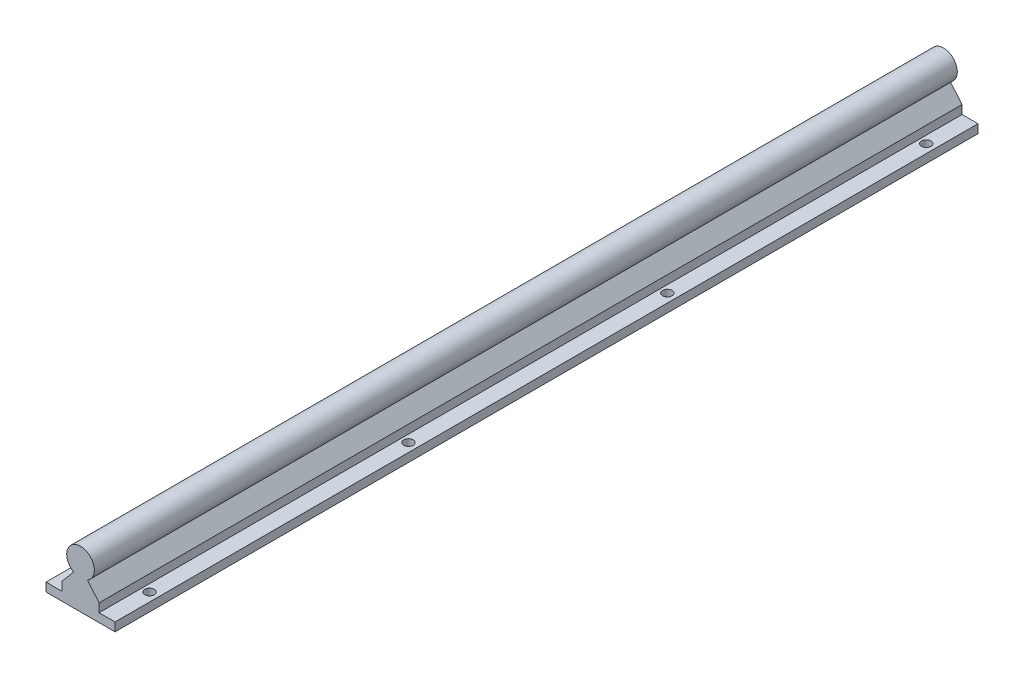
ISO-10303-21;
HEADER;
FILE_DESCRIPTION(('STEP AP214'),'2;1');
FILE_NAME('part.step','',(''),(''),'','','');
FILE_SCHEMA(('AUTOMOTIVE_DESIGN { 1 0 10303 214 1 1 1 1 }'));
ENDSEC;
DATA;
#1=APPLICATION_CONTEXT('core data for automotive mechanical design processes');
#2=APPLICATION_PROTOCOL_DEFINITION('international standard','automotive_design',2000,#1);
#3=PRODUCT_CONTEXT('',#1,'mechanical');
#4=PRODUCT('Part','Part','',(#3));
#5=PRODUCT_RELATED_PRODUCT_CATEGORY('part','',(#4));
#6=PRODUCT_DEFINITION_FORMATION('','',#4);
#7=PRODUCT_DEFINITION_CONTEXT('part definition',#1,'design');
#8=PRODUCT_DEFINITION('design','',#6,#7);
#9=PRODUCT_DEFINITION_SHAPE('','',#8);
#10=(LENGTH_UNIT() NAMED_UNIT(*) SI_UNIT(.MILLI.,.METRE.));
#11=(NAMED_UNIT(*) PLANE_ANGLE_UNIT() SI_UNIT($,.RADIAN.));
#12=(NAMED_UNIT(*) SI_UNIT($,.STERADIAN.) SOLID_ANGLE_UNIT());
#13=UNCERTAINTY_MEASURE_WITH_UNIT(LENGTH_MEASURE(1.E-05),#10,'distance_accuracy_value','');
#14=(GEOMETRIC_REPRESENTATION_CONTEXT(3) GLOBAL_UNCERTAINTY_ASSIGNED_CONTEXT((#13)) GLOBAL_UNIT_ASSIGNED_CONTEXT((#10,
#11,#12)) REPRESENTATION_CONTEXT('',''));
#15=CARTESIAN_POINT('',(0.,0.,0.));
#16=DIRECTION('',(0.,0.,1.));
#17=DIRECTION('',(1.,0.,0.));
#18=AXIS2_PLACEMENT_3D('',#15,#16,#17);
#19=CARTESIAN_POINT('',(-21.6204068953766,0.,500.));
#20=DIRECTION('',(1.,0.,0.));
#21=DIRECTION('',(0.,0.,-1.));
#22=AXIS2_PLACEMENT_3D('',#19,#20,#21);
#23=PLANE('',#22);
#24=DIRECTION('',(0.,-1.,0.));
#25=VECTOR('',#24,1.);
#26=CARTESIAN_POINT('',(-21.6204068953766,0.,0.));
#27=LINE('',#26,#25);
#28=CARTESIAN_POINT('',(-21.6204068953766,5.,0.));
#29=VERTEX_POINT('',#28);
#30=CARTESIAN_POINT('',(-21.6204068953766,0.,0.));
#31=VERTEX_POINT('',#30);
#32=EDGE_CURVE('E143',#29,#31,#27,.T.);
#33=ORIENTED_EDGE('',*,*,#32,.T.);
#34=DIRECTION('',(0.,0.,-1.));
#35=VECTOR('',#34,1.);
#36=CARTESIAN_POINT('',(-21.6204068953766,0.,500.));
#37=LINE('',#36,#35);
#38=CARTESIAN_POINT('',(-21.6204068953766,0.,500.));
#39=VERTEX_POINT('',#38);
#40=EDGE_CURVE('E11',#39,#31,#37,.T.);
#41=ORIENTED_EDGE('',*,*,#40,.F.);
#42=DIRECTION('',(0.,-1.,0.));
#43=VECTOR('',#42,1.);
#44=CARTESIAN_POINT('',(-21.6204068953766,0.,500.));
#45=LINE('',#44,#43);
#46=CARTESIAN_POINT('',(-21.6204068953766,5.,500.));
#47=VERTEX_POINT('',#46);
#48=EDGE_CURVE('E161',#47,#39,#45,.T.);
#49=ORIENTED_EDGE('',*,*,#48,.F.);
#50=DIRECTION('',(0.,0.,-1.));
#51=VECTOR('',#50,1.);
#52=CARTESIAN_POINT('',(-21.6204068953766,5.,500.));
#53=LINE('',#52,#51);
#54=EDGE_CURVE('E139',#47,#29,#53,.T.);
#55=ORIENTED_EDGE('',*,*,#54,.T.);
#56=EDGE_LOOP('',(#33,#41,#49,#55));
#57=FACE_BOUND('',#56,.T.);
#58=ADVANCED_FACE('F33',(#57),#23,.F.);
#59=CARTESIAN_POINT('',(-21.6204068953766,0.,500.));
#60=DIRECTION('',(0.,1.,0.));
#61=DIRECTION('',(0.,0.,1.));
#62=AXIS2_PLACEMENT_3D('',#59,#60,#61);
#63=PLANE('',#62);
#64=CARTESIAN_POINT('',(-16.6204068953766,0.,175.));
#65=DIRECTION('',(0.,1.,0.));
#66=DIRECTION('',(0.,0.,1.));
#67=AXIS2_PLACEMENT_3D('',#64,#65,#66);
#68=CIRCLE('',#67,2.75);
#69=CARTESIAN_POINT('',(-16.6204068953766,0.,177.75));
#70=VERTEX_POINT('',#69);
#71=EDGE_CURVE('E257',#70,#70,#68,.T.);
#72=ORIENTED_EDGE('',*,*,#71,.T.);
#73=EDGE_LOOP('',(#72));
#74=FACE_BOUND('',#73,.T.);
#75=CARTESIAN_POINT('',(13.3795931046234,0.,325.));
#76=DIRECTION('',(0.,1.,0.));
#77=DIRECTION('',(0.,0.,1.));
#78=AXIS2_PLACEMENT_3D('',#75,#76,#77);
#79=CIRCLE('',#78,2.75);
#80=CARTESIAN_POINT('',(13.3795931046234,0.,327.75));
#81=VERTEX_POINT('',#80);
#82=EDGE_CURVE('E254',#81,#81,#79,.T.);
#83=ORIENTED_EDGE('',*,*,#82,.T.);
#84=EDGE_LOOP('',(#83));
#85=FACE_BOUND('',#84,.T.);
#86=CARTESIAN_POINT('',(-16.6204068953766,0.,325.));
#87=DIRECTION('',(0.,1.,0.));
#88=DIRECTION('',(0.,0.,1.));
#89=AXIS2_PLACEMENT_3D('',#86,#87,#88);
#90=CIRCLE('',#89,2.75);
#91=CARTESIAN_POINT('',(-16.6204068953766,0.,327.75));
#92=VERTEX_POINT('',#91);
#93=EDGE_CURVE('E251',#92,#92,#90,.T.);
#94=ORIENTED_EDGE('',*,*,#93,.T.);
#95=EDGE_LOOP('',(#94));
#96=FACE_BOUND('',#95,.T.);
#97=CARTESIAN_POINT('',(13.3795931046234,0.,475.));
#98=DIRECTION('',(0.,1.,0.));
#99=DIRECTION('',(0.,0.,1.));
#100=AXIS2_PLACEMENT_3D('',#97,#98,#99);
#101=CIRCLE('',#100,2.75);
#102=CARTESIAN_POINT('',(13.3795931046234,0.,477.75));
#103=VERTEX_POINT('',#102);
#104=EDGE_CURVE('E250',#103,#103,#101,.T.);
#105=ORIENTED_EDGE('',*,*,#104,.T.);
#106=EDGE_LOOP('',(#105));
#107=FACE_BOUND('',#106,.T.);
#108=CARTESIAN_POINT('',(13.3795931046234,0.,25.));
#109=DIRECTION('',(0.,1.,0.));
#110=DIRECTION('',(0.,0.,1.));
#111=AXIS2_PLACEMENT_3D('',#108,#109,#110);
#112=CIRCLE('',#111,2.75);
#113=CARTESIAN_POINT('',(13.3795931046234,0.,27.75));
#114=VERTEX_POINT('',#113);
#115=EDGE_CURVE('E266',#114,#114,#112,.T.);
#116=ORIENTED_EDGE('',*,*,#115,.T.);
#117=EDGE_LOOP('',(#116));
#118=FACE_BOUND('',#117,.T.);
#119=CARTESIAN_POINT('',(-16.6204068953766,0.,25.));
#120=DIRECTION('',(0.,1.,0.));
#121=DIRECTION('',(0.,0.,1.));
#122=AXIS2_PLACEMENT_3D('',#119,#120,#121);
#123=CIRCLE('',#122,2.75);
#124=CARTESIAN_POINT('',(-16.6204068953766,0.,27.75));
#125=VERTEX_POINT('',#124);
#126=EDGE_CURVE('E263',#125,#125,#123,.T.);
#127=ORIENTED_EDGE('',*,*,#126,.T.);
#128=EDGE_LOOP('',(#127));
#129=FACE_BOUND('',#128,.T.);
#130=CARTESIAN_POINT('',(13.3795931046234,0.,175.));
#131=DIRECTION('',(0.,1.,0.));
#132=DIRECTION('',(0.,0.,1.));
#133=AXIS2_PLACEMENT_3D('',#130,#131,#132);
#134=CIRCLE('',#133,2.75);
#135=CARTESIAN_POINT('',(13.3795931046234,0.,177.75));
#136=VERTEX_POINT('',#135);
#137=EDGE_CURVE('E260',#136,#136,#134,.T.);
#138=ORIENTED_EDGE('',*,*,#137,.T.);
#139=EDGE_LOOP('',(#138));
#140=FACE_BOUND('',#139,.T.);
#141=CARTESIAN_POINT('',(-16.6204068953766,0.,475.));
#142=DIRECTION('',(0.,1.,0.));
#143=DIRECTION('',(0.,0.,1.));
#144=AXIS2_PLACEMENT_3D('',#141,#142,#143);
#145=CIRCLE('',#144,2.75);
#146=CARTESIAN_POINT('',(-16.6204068953766,0.,477.75));
#147=VERTEX_POINT('',#146);
#148=EDGE_CURVE('E183',#147,#147,#145,.T.);
#149=ORIENTED_EDGE('',*,*,#148,.T.);
#150=EDGE_LOOP('',(#149));
#151=FACE_BOUND('',#150,.T.);
#152=DIRECTION('',(1.,0.,0.));
#153=VECTOR('',#152,1.);
#154=CARTESIAN_POINT('',(-21.6204068953766,0.,0.));
#155=LINE('',#154,#153);
#156=CARTESIAN_POINT('',(18.3795931046234,0.,0.));
#157=VERTEX_POINT('',#156);
#158=EDGE_CURVE('E146',#31,#157,#155,.T.);
#159=ORIENTED_EDGE('',*,*,#158,.T.);
#160=DIRECTION('',(0.,0.,-1.));
#161=VECTOR('',#160,1.);
#162=CARTESIAN_POINT('',(18.3795931046234,0.,500.));
#163=LINE('',#162,#161);
#164=CARTESIAN_POINT('',(18.3795931046234,0.,500.));
#165=VERTEX_POINT('',#164);
#166=EDGE_CURVE('E42',#165,#157,#163,.T.);
#167=ORIENTED_EDGE('',*,*,#166,.F.);
#168=DIRECTION('',(1.,0.,0.));
#169=VECTOR('',#168,1.);
#170=CARTESIAN_POINT('',(-21.6204068953766,0.,500.));
#171=LINE('',#170,#169);
#172=EDGE_CURVE('E100',#39,#165,#171,.T.);
#173=ORIENTED_EDGE('',*,*,#172,.F.);
#174=ORIENTED_EDGE('',*,*,#40,.T.);
#175=EDGE_LOOP('',(#159,#167,#173,#174));
#176=FACE_BOUND('',#175,.T.);
#177=ADVANCED_FACE('F272',(#74,#85,#96,#107,#118,#129,#140,#151,#176),#63,.F.);
#178=CARTESIAN_POINT('',(18.3795931046234,0.,500.));
#179=DIRECTION('',(-1.,0.,0.));
#180=DIRECTION('',(0.,0.,1.));
#181=AXIS2_PLACEMENT_3D('',#178,#179,#180);
#182=PLANE('',#181);
#183=DIRECTION('',(0.,1.,0.));
#184=VECTOR('',#183,1.);
#185=CARTESIAN_POINT('',(18.3795931046234,0.,0.));
#186=LINE('',#185,#184);
#187=CARTESIAN_POINT('',(18.3795931046234,5.,0.));
#188=VERTEX_POINT('',#187);
#189=EDGE_CURVE('E148',#157,#188,#186,.T.);
#190=ORIENTED_EDGE('',*,*,#189,.T.);
#191=DIRECTION('',(0.,0.,-1.));
#192=VECTOR('',#191,1.);
#193=CARTESIAN_POINT('',(18.3795931046234,5.,500.));
#194=LINE('',#193,#192);
#195=CARTESIAN_POINT('',(18.3795931046234,5.,500.));
#196=VERTEX_POINT('',#195);
#197=EDGE_CURVE('E174',#196,#188,#194,.T.);
#198=ORIENTED_EDGE('',*,*,#197,.F.);
#199=DIRECTION('',(0.,1.,0.));
#200=VECTOR('',#199,1.);
#201=CARTESIAN_POINT('',(18.3795931046234,0.,500.));
#202=LINE('',#201,#200);
#203=EDGE_CURVE('E244',#165,#196,#202,.T.);
#204=ORIENTED_EDGE('',*,*,#203,.F.);
#205=ORIENTED_EDGE('',*,*,#166,.T.);
#206=EDGE_LOOP('',(#190,#198,#204,#205));
#207=FACE_BOUND('',#206,.T.);
#208=ADVANCED_FACE('F210',(#207),#182,.F.);
#209=CARTESIAN_POINT('',(18.3795931046234,5.,500.));
#210=DIRECTION('',(0.,-1.,0.));
#211=DIRECTION('',(0.,0.,-1.));
#212=AXIS2_PLACEMENT_3D('',#209,#210,#211);
#213=PLANE('',#212);
#214=CARTESIAN_POINT('',(13.3795931046234,5.,325.));
#215=DIRECTION('',(0.,-1.,0.));
#216=DIRECTION('',(0.,0.,-1.));
#217=AXIS2_PLACEMENT_3D('',#214,#215,#216);
#218=CIRCLE('',#217,2.75);
#219=CARTESIAN_POINT('',(13.3795931046234,5.,322.25));
#220=VERTEX_POINT('',#219);
#221=EDGE_CURVE('E36',#220,#220,#218,.F.);
#222=ORIENTED_EDGE('',*,*,#221,.F.);
#223=EDGE_LOOP('',(#222));
#224=FACE_BOUND('',#223,.T.);
#225=CARTESIAN_POINT('',(13.3795931046234,5.,475.));
#226=DIRECTION('',(0.,-1.,0.));
#227=DIRECTION('',(0.,0.,-1.));
#228=AXIS2_PLACEMENT_3D('',#225,#226,#227);
#229=CIRCLE('',#228,2.75);
#230=CARTESIAN_POINT('',(13.3795931046234,5.,472.25));
#231=VERTEX_POINT('',#230);
#232=EDGE_CURVE('E197',#231,#231,#229,.F.);
#233=ORIENTED_EDGE('',*,*,#232,.F.);
#234=EDGE_LOOP('',(#233));
#235=FACE_BOUND('',#234,.T.);
#236=CARTESIAN_POINT('',(13.3795931046234,5.,25.));
#237=DIRECTION('',(0.,-1.,0.));
#238=DIRECTION('',(0.,0.,-1.));
#239=AXIS2_PLACEMENT_3D('',#236,#237,#238);
#240=CIRCLE('',#239,2.75);
#241=CARTESIAN_POINT('',(13.3795931046234,5.,22.25));
#242=VERTEX_POINT('',#241);
#243=EDGE_CURVE('E195',#242,#242,#240,.F.);
#244=ORIENTED_EDGE('',*,*,#243,.F.);
#245=EDGE_LOOP('',(#244));
#246=FACE_BOUND('',#245,.T.);
#247=CARTESIAN_POINT('',(13.3795931046234,5.,175.));
#248=DIRECTION('',(0.,-1.,0.));
#249=DIRECTION('',(0.,0.,-1.));
#250=AXIS2_PLACEMENT_3D('',#247,#248,#249);
#251=CIRCLE('',#250,2.75);
#252=CARTESIAN_POINT('',(13.3795931046234,5.,172.25));
#253=VERTEX_POINT('',#252);
#254=EDGE_CURVE('E192',#253,#253,#251,.F.);
#255=ORIENTED_EDGE('',*,*,#254,.F.);
#256=EDGE_LOOP('',(#255));
#257=FACE_BOUND('',#256,.T.);
#258=DIRECTION('',(-1.,0.,0.));
#259=VECTOR('',#258,1.);
#260=CARTESIAN_POINT('',(18.3795931046234,5.,0.));
#261=LINE('',#260,#259);
#262=CARTESIAN_POINT('',(9.15263479703719,5.,0.));
#263=VERTEX_POINT('',#262);
#264=EDGE_CURVE('E150',#188,#263,#261,.T.);
#265=ORIENTED_EDGE('',*,*,#264,.T.);
#266=DIRECTION('',(0.,0.,-1.));
#267=VECTOR('',#266,1.);
#268=CARTESIAN_POINT('',(9.15263479703719,5.,500.));
#269=LINE('',#268,#267);
#270=CARTESIAN_POINT('',(9.15263479703719,5.,500.));
#271=VERTEX_POINT('',#270);
#272=EDGE_CURVE('E171',#271,#263,#269,.T.);
#273=ORIENTED_EDGE('',*,*,#272,.F.);
#274=DIRECTION('',(-1.,0.,0.));
#275=VECTOR('',#274,1.);
#276=CARTESIAN_POINT('',(18.3795931046234,5.,500.));
#277=LINE('',#276,#275);
#278=EDGE_CURVE('E242',#196,#271,#277,.T.);
#279=ORIENTED_EDGE('',*,*,#278,.F.);
#280=ORIENTED_EDGE('',*,*,#197,.T.);
#281=EDGE_LOOP('',(#265,#273,#279,#280));
#282=FACE_BOUND('',#281,.T.);
#283=ADVANCED_FACE('F206',(#224,#235,#246,#257,#282),#213,.F.);
#284=CARTESIAN_POINT('',(9.15263479703719,5.,500.));
#285=DIRECTION('',(-1.,0.,0.));
#286=DIRECTION('',(0.,0.,1.));
#287=AXIS2_PLACEMENT_3D('',#284,#285,#286);
#288=PLANE('',#287);
#289=DIRECTION('',(0.,1.,0.));
#290=VECTOR('',#289,1.);
#291=CARTESIAN_POINT('',(9.15263479703719,5.,0.));
#292=LINE('',#291,#290);
#293=CARTESIAN_POINT('',(9.15263479703719,10.,0.));
#294=VERTEX_POINT('',#293);
#295=EDGE_CURVE('E152',#263,#294,#292,.T.);
#296=ORIENTED_EDGE('',*,*,#295,.T.);
#297=DIRECTION('',(0.,0.,-1.));
#298=VECTOR('',#297,1.);
#299=CARTESIAN_POINT('',(9.15263479703719,10.,500.));
#300=LINE('',#299,#298);
#301=CARTESIAN_POINT('',(9.15263479703719,10.,500.));
#302=VERTEX_POINT('',#301);
#303=EDGE_CURVE('E168',#302,#294,#300,.T.);
#304=ORIENTED_EDGE('',*,*,#303,.F.);
#305=DIRECTION('',(0.,1.,0.));
#306=VECTOR('',#305,1.);
#307=CARTESIAN_POINT('',(9.15263479703719,5.,500.));
#308=LINE('',#307,#306);
#309=EDGE_CURVE('E227',#271,#302,#308,.T.);
#310=ORIENTED_EDGE('',*,*,#309,.F.);
#311=ORIENTED_EDGE('',*,*,#272,.T.);
#312=EDGE_LOOP('',(#296,#304,#310,#311));
#313=FACE_BOUND('',#312,.T.);
#314=ADVANCED_FACE('F209',(#313),#288,.F.);
#315=CARTESIAN_POINT('',(9.15263479703719,10.,500.));
#316=DIRECTION('',(-0.766044443118977,-0.64278760968654,0.));
#317=DIRECTION('',(0.64278760968654,-0.766044443118977,0.));
#318=AXIS2_PLACEMENT_3D('',#315,#316,#317);
#319=PLANE('',#318);
#320=DIRECTION('',(-0.64278760968654,0.766044443118977,0.));
#321=VECTOR('',#320,1.);
#322=CARTESIAN_POINT('',(9.15263479703719,10.,0.));
#323=LINE('',#322,#321);
#324=CARTESIAN_POINT('',(2.37959310462339,18.0717967697245,0.));
#325=VERTEX_POINT('',#324);
#326=EDGE_CURVE('E154',#294,#325,#323,.T.);
#327=ORIENTED_EDGE('',*,*,#326,.T.);
#328=DIRECTION('',(0.,0.,-1.));
#329=VECTOR('',#328,1.);
#330=CARTESIAN_POINT('',(2.37959310462339,18.0717967697245,500.));
#331=LINE('',#330,#329);
#332=CARTESIAN_POINT('',(2.37959310462339,18.0717967697245,500.));
#333=VERTEX_POINT('',#332);
#334=EDGE_CURVE('E165',#333,#325,#331,.T.);
#335=ORIENTED_EDGE('',*,*,#334,.F.);
#336=DIRECTION('',(-0.64278760968654,0.766044443118977,0.));
#337=VECTOR('',#336,1.);
#338=CARTESIAN_POINT('',(9.15263479703719,10.,500.));
#339=LINE('',#338,#337);
#340=EDGE_CURVE('E238',#302,#333,#339,.T.);
#341=ORIENTED_EDGE('',*,*,#340,.F.);
#342=ORIENTED_EDGE('',*,*,#303,.T.);
#343=EDGE_LOOP('',(#327,#335,#341,#342));
#344=FACE_BOUND('',#343,.T.);
#345=ADVANCED_FACE('F234',(#344),#319,.F.);
#346=CARTESIAN_POINT('',(-1.62040689537661,25.,500.));
#347=DIRECTION('',(0.,0.,-1.));
#348=DIRECTION('',(-1.,0.,0.));
#349=AXIS2_PLACEMENT_3D('',#346,#347,#348);
#350=CYLINDRICAL_SURFACE('',#349,8.);
#351=CARTESIAN_POINT('',(-1.62040689537661,25.,0.));
#352=DIRECTION('',(0.,0.,1.));
#353=DIRECTION('',(-1.,0.,0.));
#354=AXIS2_PLACEMENT_3D('',#351,#352,#353);
#355=CIRCLE('',#354,8.);
#356=CARTESIAN_POINT('',(-5.6204068953766,18.0717967697245,0.));
#357=VERTEX_POINT('',#356);
#358=EDGE_CURVE('E156',#325,#357,#355,.T.);
#359=ORIENTED_EDGE('',*,*,#358,.T.);
#360=DIRECTION('',(0.,0.,-1.));
#361=VECTOR('',#360,1.);
#362=CARTESIAN_POINT('',(-5.6204068953766,18.0717967697245,500.));
#363=LINE('',#362,#361);
#364=CARTESIAN_POINT('',(-5.6204068953766,18.0717967697245,500.));
#365=VERTEX_POINT('',#364);
#366=EDGE_CURVE('E134',#365,#357,#363,.T.);
#367=ORIENTED_EDGE('',*,*,#366,.F.);
#368=CARTESIAN_POINT('',(-1.62040689537661,25.,500.));
#369=DIRECTION('',(0.,0.,1.));
#370=DIRECTION('',(-1.,0.,0.));
#371=AXIS2_PLACEMENT_3D('',#368,#369,#370);
#372=CIRCLE('',#371,8.);
#373=EDGE_CURVE('E125',#333,#365,#372,.T.);
#374=ORIENTED_EDGE('',*,*,#373,.F.);
#375=ORIENTED_EDGE('',*,*,#334,.T.);
#376=EDGE_LOOP('',(#359,#367,#374,#375));
#377=FACE_BOUND('',#376,.T.);
#378=ADVANCED_FACE('F237',(#377),#350,.T.);
#379=CARTESIAN_POINT('',(-12.3934485877904,10.,500.));
#380=DIRECTION('',(0.766044443118977,-0.642787609686541,0.));
#381=DIRECTION('',(0.642787609686541,0.766044443118977,0.));
#382=AXIS2_PLACEMENT_3D('',#379,#380,#381);
#383=PLANE('',#382);
#384=DIRECTION('',(-0.642787609686541,-0.766044443118977,0.));
#385=VECTOR('',#384,1.);
#386=CARTESIAN_POINT('',(-12.3934485877904,10.,0.));
#387=LINE('',#386,#385);
#388=CARTESIAN_POINT('',(-12.3934485877904,10.,0.));
#389=VERTEX_POINT('',#388);
#390=EDGE_CURVE('E133',#357,#389,#387,.T.);
#391=ORIENTED_EDGE('',*,*,#390,.T.);
#392=DIRECTION('',(0.,0.,-1.));
#393=VECTOR('',#392,1.);
#394=CARTESIAN_POINT('',(-12.3934485877904,10.,500.));
#395=LINE('',#394,#393);
#396=CARTESIAN_POINT('',(-12.3934485877904,10.,500.));
#397=VERTEX_POINT('',#396);
#398=EDGE_CURVE('E130',#397,#389,#395,.T.);
#399=ORIENTED_EDGE('',*,*,#398,.F.);
#400=DIRECTION('',(-0.642787609686541,-0.766044443118977,0.));
#401=VECTOR('',#400,1.);
#402=CARTESIAN_POINT('',(-12.3934485877904,10.,500.));
#403=LINE('',#402,#401);
#404=EDGE_CURVE('E119',#365,#397,#403,.T.);
#405=ORIENTED_EDGE('',*,*,#404,.F.);
#406=ORIENTED_EDGE('',*,*,#366,.T.);
#407=EDGE_LOOP('',(#391,#399,#405,#406));
#408=FACE_BOUND('',#407,.T.);
#409=ADVANCED_FACE('F131',(#408),#383,.F.);
#410=CARTESIAN_POINT('',(-12.3934485877904,5.,500.));
#411=DIRECTION('',(1.,0.,0.));
#412=DIRECTION('',(0.,0.,-1.));
#413=AXIS2_PLACEMENT_3D('',#410,#411,#412);
#414=PLANE('',#413);
#415=DIRECTION('',(0.,-1.,0.));
#416=VECTOR('',#415,1.);
#417=CARTESIAN_POINT('',(-12.3934485877904,5.,0.));
#418=LINE('',#417,#416);
#419=CARTESIAN_POINT('',(-12.3934485877904,5.,0.));
#420=VERTEX_POINT('',#419);
#421=EDGE_CURVE('E86',#389,#420,#418,.T.);
#422=ORIENTED_EDGE('',*,*,#421,.T.);
#423=DIRECTION('',(0.,0.,-1.));
#424=VECTOR('',#423,1.);
#425=CARTESIAN_POINT('',(-12.3934485877904,5.,500.));
#426=LINE('',#425,#424);
#427=CARTESIAN_POINT('',(-12.3934485877904,5.,500.));
#428=VERTEX_POINT('',#427);
#429=EDGE_CURVE('E135',#428,#420,#426,.T.);
#430=ORIENTED_EDGE('',*,*,#429,.F.);
#431=DIRECTION('',(0.,-1.,0.));
#432=VECTOR('',#431,1.);
#433=CARTESIAN_POINT('',(-12.3934485877904,5.,500.));
#434=LINE('',#433,#432);
#435=EDGE_CURVE('E123',#397,#428,#434,.T.);
#436=ORIENTED_EDGE('',*,*,#435,.F.);
#437=ORIENTED_EDGE('',*,*,#398,.T.);
#438=EDGE_LOOP('',(#422,#430,#436,#437));
#439=FACE_BOUND('',#438,.T.);
#440=ADVANCED_FACE('F137',(#439),#414,.F.);
#441=CARTESIAN_POINT('',(-21.6204068953766,5.,500.));
#442=DIRECTION('',(0.,-1.,0.));
#443=DIRECTION('',(0.,0.,-1.));
#444=AXIS2_PLACEMENT_3D('',#441,#442,#443);
#445=PLANE('',#444);
#446=CARTESIAN_POINT('',(-16.6204068953766,5.,175.));
#447=DIRECTION('',(0.,-1.,0.));
#448=DIRECTION('',(0.,0.,-1.));
#449=AXIS2_PLACEMENT_3D('',#446,#447,#448);
#450=CIRCLE('',#449,2.75);
#451=CARTESIAN_POINT('',(-16.6204068953766,5.,172.25));
#452=VERTEX_POINT('',#451);
#453=EDGE_CURVE('E189',#452,#452,#450,.F.);
#454=ORIENTED_EDGE('',*,*,#453,.F.);
#455=EDGE_LOOP('',(#454));
#456=FACE_BOUND('',#455,.T.);
#457=CARTESIAN_POINT('',(-16.6204068953766,5.,325.));
#458=DIRECTION('',(0.,-1.,0.));
#459=DIRECTION('',(0.,0.,-1.));
#460=AXIS2_PLACEMENT_3D('',#457,#458,#459);
#461=CIRCLE('',#460,2.75);
#462=CARTESIAN_POINT('',(-16.6204068953766,5.,322.25));
#463=VERTEX_POINT('',#462);
#464=EDGE_CURVE('E186',#463,#463,#461,.F.);
#465=ORIENTED_EDGE('',*,*,#464,.F.);
#466=EDGE_LOOP('',(#465));
#467=FACE_BOUND('',#466,.T.);
#468=CARTESIAN_POINT('',(-16.6204068953766,5.,25.));
#469=DIRECTION('',(0.,-1.,0.));
#470=DIRECTION('',(0.,0.,-1.));
#471=AXIS2_PLACEMENT_3D('',#468,#469,#470);
#472=CIRCLE('',#471,2.75);
#473=CARTESIAN_POINT('',(-16.6204068953766,5.,22.25));
#474=VERTEX_POINT('',#473);
#475=EDGE_CURVE('E182',#474,#474,#472,.F.);
#476=ORIENTED_EDGE('',*,*,#475,.F.);
#477=EDGE_LOOP('',(#476));
#478=FACE_BOUND('',#477,.T.);
#479=CARTESIAN_POINT('',(-16.6204068953766,5.,475.));
#480=DIRECTION('',(0.,-1.,0.));
#481=DIRECTION('',(0.,0.,-1.));
#482=AXIS2_PLACEMENT_3D('',#479,#480,#481);
#483=CIRCLE('',#482,2.75);
#484=CARTESIAN_POINT('',(-16.6204068953766,5.,472.25));
#485=VERTEX_POINT('',#484);
#486=EDGE_CURVE('E179',#485,#485,#483,.F.);
#487=ORIENTED_EDGE('',*,*,#486,.F.);
#488=EDGE_LOOP('',(#487));
#489=FACE_BOUND('',#488,.T.);
#490=DIRECTION('',(-1.,0.,0.));
#491=VECTOR('',#490,1.);
#492=CARTESIAN_POINT('',(-21.6204068953766,5.,0.));
#493=LINE('',#492,#491);
#494=EDGE_CURVE('E92',#420,#29,#493,.T.);
#495=ORIENTED_EDGE('',*,*,#494,.T.);
#496=ORIENTED_EDGE('',*,*,#54,.F.);
#497=DIRECTION('',(-1.,0.,0.));
#498=VECTOR('',#497,1.);
#499=CARTESIAN_POINT('',(-21.6204068953766,5.,500.));
#500=LINE('',#499,#498);
#501=EDGE_CURVE('E51',#428,#47,#500,.T.);
#502=ORIENTED_EDGE('',*,*,#501,.F.);
#503=ORIENTED_EDGE('',*,*,#429,.T.);
#504=EDGE_LOOP('',(#495,#496,#502,#503));
#505=FACE_BOUND('',#504,.T.);
#506=ADVANCED_FACE('F315',(#456,#467,#478,#489,#505),#445,.F.);
#507=CARTESIAN_POINT('',(-1.62040689537661,25.,500.));
#508=DIRECTION('',(0.,0.,-1.));
#509=DIRECTION('',(-1.,0.,0.));
#510=AXIS2_PLACEMENT_3D('',#507,#508,#509);
#511=PLANE('',#510);
#512=ORIENTED_EDGE('',*,*,#48,.T.);
#513=ORIENTED_EDGE('',*,*,#172,.T.);
#514=ORIENTED_EDGE('',*,*,#203,.T.);
#515=ORIENTED_EDGE('',*,*,#278,.T.);
#516=ORIENTED_EDGE('',*,*,#309,.T.);
#517=ORIENTED_EDGE('',*,*,#340,.T.);
#518=ORIENTED_EDGE('',*,*,#373,.T.);
#519=ORIENTED_EDGE('',*,*,#404,.T.);
#520=ORIENTED_EDGE('',*,*,#435,.T.);
#521=ORIENTED_EDGE('',*,*,#501,.T.);
#522=EDGE_LOOP('',(#512,#513,#514,#515,#516,#517,#518,#519,#520,#521));
#523=FACE_BOUND('',#522,.T.);
#524=ADVANCED_FACE('F121',(#523),#511,.F.);
#525=CARTESIAN_POINT('',(-1.62040689537661,25.,0.));
#526=DIRECTION('',(0.,0.,-1.));
#527=DIRECTION('',(-1.,0.,0.));
#528=AXIS2_PLACEMENT_3D('',#525,#526,#527);
#529=PLANE('',#528);
#530=ORIENTED_EDGE('',*,*,#32,.F.);
#531=ORIENTED_EDGE('',*,*,#494,.F.);
#532=ORIENTED_EDGE('',*,*,#421,.F.);
#533=ORIENTED_EDGE('',*,*,#390,.F.);
#534=ORIENTED_EDGE('',*,*,#358,.F.);
#535=ORIENTED_EDGE('',*,*,#326,.F.);
#536=ORIENTED_EDGE('',*,*,#295,.F.);
#537=ORIENTED_EDGE('',*,*,#264,.F.);
#538=ORIENTED_EDGE('',*,*,#189,.F.);
#539=ORIENTED_EDGE('',*,*,#158,.F.);
#540=EDGE_LOOP('',(#530,#531,#532,#533,#534,#535,#536,#537,#538,#539));
#541=FACE_BOUND('',#540,.T.);
#542=ADVANCED_FACE('F230',(#541),#529,.T.);
#543=CARTESIAN_POINT('',(-16.6204068953766,33.,475.));
#544=DIRECTION('',(0.,-1.,0.));
#545=DIRECTION('',(0.,0.,-1.));
#546=AXIS2_PLACEMENT_3D('',#543,#544,#545);
#547=CYLINDRICAL_SURFACE('',#546,2.75);
#548=ORIENTED_EDGE('',*,*,#148,.F.);
#549=EDGE_LOOP('',(#548));
#550=FACE_BOUND('',#549,.T.);
#551=ORIENTED_EDGE('',*,*,#486,.T.);
#552=EDGE_LOOP('',(#551));
#553=FACE_BOUND('',#552,.T.);
#554=ADVANCED_FACE('F321',(#550,#553),#547,.F.);
#555=CARTESIAN_POINT('',(-16.6204068953766,33.,25.));
#556=DIRECTION('',(0.,-1.,0.));
#557=DIRECTION('',(0.,0.,-1.));
#558=AXIS2_PLACEMENT_3D('',#555,#556,#557);
#559=CYLINDRICAL_SURFACE('',#558,2.75);
#560=ORIENTED_EDGE('',*,*,#126,.F.);
#561=EDGE_LOOP('',(#560));
#562=FACE_BOUND('',#561,.T.);
#563=ORIENTED_EDGE('',*,*,#475,.T.);
#564=EDGE_LOOP('',(#563));
#565=FACE_BOUND('',#564,.T.);
#566=ADVANCED_FACE('F326',(#562,#565),#559,.F.);
#567=CARTESIAN_POINT('',(-16.6204068953766,33.,325.));
#568=DIRECTION('',(0.,-1.,0.));
#569=DIRECTION('',(0.,0.,-1.));
#570=AXIS2_PLACEMENT_3D('',#567,#568,#569);
#571=CYLINDRICAL_SURFACE('',#570,2.75);
#572=ORIENTED_EDGE('',*,*,#93,.F.);
#573=EDGE_LOOP('',(#572));
#574=FACE_BOUND('',#573,.T.);
#575=ORIENTED_EDGE('',*,*,#464,.T.);
#576=EDGE_LOOP('',(#575));
#577=FACE_BOUND('',#576,.T.);
#578=ADVANCED_FACE('F328',(#574,#577),#571,.F.);
#579=CARTESIAN_POINT('',(-16.6204068953766,33.,175.));
#580=DIRECTION('',(0.,-1.,0.));
#581=DIRECTION('',(0.,0.,-1.));
#582=AXIS2_PLACEMENT_3D('',#579,#580,#581);
#583=CYLINDRICAL_SURFACE('',#582,2.75);
#584=ORIENTED_EDGE('',*,*,#71,.F.);
#585=EDGE_LOOP('',(#584));
#586=FACE_BOUND('',#585,.T.);
#587=ORIENTED_EDGE('',*,*,#453,.T.);
#588=EDGE_LOOP('',(#587));
#589=FACE_BOUND('',#588,.T.);
#590=ADVANCED_FACE('F287',(#586,#589),#583,.F.);
#591=CARTESIAN_POINT('',(13.3795931046234,33.,175.));
#592=DIRECTION('',(0.,-1.,0.));
#593=DIRECTION('',(0.,0.,-1.));
#594=AXIS2_PLACEMENT_3D('',#591,#592,#593);
#595=CYLINDRICAL_SURFACE('',#594,2.75);
#596=ORIENTED_EDGE('',*,*,#137,.F.);
#597=EDGE_LOOP('',(#596));
#598=FACE_BOUND('',#597,.T.);
#599=ORIENTED_EDGE('',*,*,#254,.T.);
#600=EDGE_LOOP('',(#599));
#601=FACE_BOUND('',#600,.T.);
#602=ADVANCED_FACE('F279',(#598,#601),#595,.F.);
#603=CARTESIAN_POINT('',(13.3795931046234,33.,25.));
#604=DIRECTION('',(0.,-1.,0.));
#605=DIRECTION('',(0.,0.,-1.));
#606=AXIS2_PLACEMENT_3D('',#603,#604,#605);
#607=CYLINDRICAL_SURFACE('',#606,2.75);
#608=ORIENTED_EDGE('',*,*,#115,.F.);
#609=EDGE_LOOP('',(#608));
#610=FACE_BOUND('',#609,.T.);
#611=ORIENTED_EDGE('',*,*,#243,.T.);
#612=EDGE_LOOP('',(#611));
#613=FACE_BOUND('',#612,.T.);
#614=ADVANCED_FACE('F275',(#610,#613),#607,.F.);
#615=CARTESIAN_POINT('',(13.3795931046234,33.,475.));
#616=DIRECTION('',(0.,-1.,0.));
#617=DIRECTION('',(0.,0.,-1.));
#618=AXIS2_PLACEMENT_3D('',#615,#616,#617);
#619=CYLINDRICAL_SURFACE('',#618,2.75);
#620=ORIENTED_EDGE('',*,*,#104,.F.);
#621=EDGE_LOOP('',(#620));
#622=FACE_BOUND('',#621,.T.);
#623=ORIENTED_EDGE('',*,*,#232,.T.);
#624=EDGE_LOOP('',(#623));
#625=FACE_BOUND('',#624,.T.);
#626=ADVANCED_FACE('F278',(#622,#625),#619,.F.);
#627=CARTESIAN_POINT('',(13.3795931046234,33.,325.));
#628=DIRECTION('',(0.,-1.,0.));
#629=DIRECTION('',(0.,0.,-1.));
#630=AXIS2_PLACEMENT_3D('',#627,#628,#629);
#631=CYLINDRICAL_SURFACE('',#630,2.75);
#632=ORIENTED_EDGE('',*,*,#82,.F.);
#633=EDGE_LOOP('',(#632));
#634=FACE_BOUND('',#633,.T.);
#635=ORIENTED_EDGE('',*,*,#221,.T.);
#636=EDGE_LOOP('',(#635));
#637=FACE_BOUND('',#636,.T.);
#638=ADVANCED_FACE('F204',(#634,#637),#631,.F.);
#639=CLOSED_SHELL('',(#58,#177,#208,#283,#314,#345,#378,#409,#440,#506,#524,#542,#554,#566,#578,
#590,#602,#614,#626,#638));
#640=MANIFOLD_SOLID_BREP('B2',#639);
#641=ADVANCED_BREP_SHAPE_REPRESENTATION('',(#18,#640),#14);
#642=SHAPE_DEFINITION_REPRESENTATION(#9,#641);
ENDSEC;
END-ISO-10303-21;
